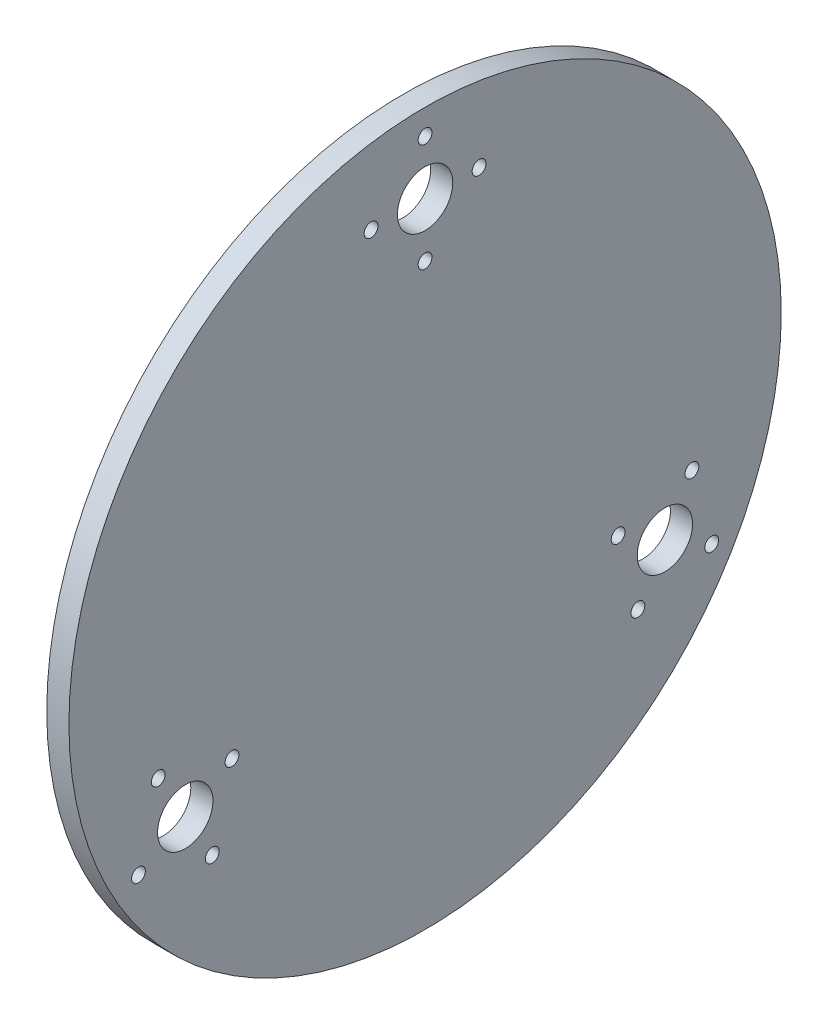
ISO-10303-21;
HEADER;
FILE_DESCRIPTION(('STEP AP214'),'2;1');
FILE_NAME('part.step','',(''),(''),'','','');
FILE_SCHEMA(('AUTOMOTIVE_DESIGN { 1 0 10303 214 1 1 1 1 }'));
ENDSEC;
DATA;
#1=APPLICATION_CONTEXT('core data for automotive mechanical design processes');
#2=APPLICATION_PROTOCOL_DEFINITION('international standard','automotive_design',2000,#1);
#3=PRODUCT_CONTEXT('',#1,'mechanical');
#4=PRODUCT('Part','Part','',(#3));
#5=PRODUCT_RELATED_PRODUCT_CATEGORY('part','',(#4));
#6=PRODUCT_DEFINITION_FORMATION('','',#4);
#7=PRODUCT_DEFINITION_CONTEXT('part definition',#1,'design');
#8=PRODUCT_DEFINITION('design','',#6,#7);
#9=PRODUCT_DEFINITION_SHAPE('','',#8);
#10=(LENGTH_UNIT() NAMED_UNIT(*) SI_UNIT(.MILLI.,.METRE.));
#11=(NAMED_UNIT(*) PLANE_ANGLE_UNIT() SI_UNIT($,.RADIAN.));
#12=(NAMED_UNIT(*) SI_UNIT($,.STERADIAN.) SOLID_ANGLE_UNIT());
#13=UNCERTAINTY_MEASURE_WITH_UNIT(LENGTH_MEASURE(1.E-05),#10,'distance_accuracy_value','');
#14=(GEOMETRIC_REPRESENTATION_CONTEXT(3) GLOBAL_UNCERTAINTY_ASSIGNED_CONTEXT((#13)) GLOBAL_UNIT_ASSIGNED_CONTEXT((#10,
#11,#12)) REPRESENTATION_CONTEXT('',''));
#15=CARTESIAN_POINT('',(0.,0.,0.));
#16=DIRECTION('',(0.,0.,1.));
#17=DIRECTION('',(1.,0.,0.));
#18=AXIS2_PLACEMENT_3D('',#15,#16,#17);
#19=CARTESIAN_POINT('',(4.,0.,0.));
#20=DIRECTION('',(1.,0.,0.));
#21=DIRECTION('',(0.,0.,-1.));
#22=AXIS2_PLACEMENT_3D('',#19,#20,#21);
#23=PLANE('',#22);
#24=CARTESIAN_POINT('',(4.,-20.1250000000015,34.857522502321));
#25=DIRECTION('',(1.,0.,0.));
#26=DIRECTION('',(0.,0.,-1.));
#27=AXIS2_PLACEMENT_3D('',#24,#25,#26);
#28=CIRCLE('',#27,1.25);
#29=CARTESIAN_POINT('',(4.,-20.1250000000015,33.607522502321));
#30=VERTEX_POINT('',#29);
#31=EDGE_CURVE('E122',#30,#30,#28,.T.);
#32=ORIENTED_EDGE('',*,*,#31,.F.);
#33=EDGE_LOOP('',(#32));
#34=FACE_BOUND('',#33,.T.);
#35=CARTESIAN_POINT('',(4.,-29.8750000000015,51.7450178761176));
#36=DIRECTION('',(1.,0.,0.));
#37=DIRECTION('',(0.,0.,-1.));
#38=AXIS2_PLACEMENT_3D('',#35,#36,#37);
#39=CIRCLE('',#38,1.25);
#40=CARTESIAN_POINT('',(4.,-29.8750000000015,50.4950178761176));
#41=VERTEX_POINT('',#40);
#42=EDGE_CURVE('E110',#41,#41,#39,.T.);
#43=ORIENTED_EDGE('',*,*,#42,.F.);
#44=EDGE_LOOP('',(#43));
#45=FACE_BOUND('',#44,.T.);
#46=CARTESIAN_POINT('',(4.,-16.5562523131002,-48.1762701892246));
#47=DIRECTION('',(1.,0.,0.));
#48=DIRECTION('',(0.,0.,-1.));
#49=AXIS2_PLACEMENT_3D('',#46,#47,#48);
#50=CIRCLE('',#49,1.25);
#51=CARTESIAN_POINT('',(4.,-16.5562523131002,-49.4262701892246));
#52=VERTEX_POINT('',#51);
#53=EDGE_CURVE('E98',#52,#52,#50,.T.);
#54=ORIENTED_EDGE('',*,*,#53,.F.);
#55=EDGE_LOOP('',(#54));
#56=FACE_BOUND('',#55,.T.);
#57=CARTESIAN_POINT('',(4.,50.,9.75));
#58=DIRECTION('',(1.,0.,0.));
#59=DIRECTION('',(0.,0.,-1.));
#60=AXIS2_PLACEMENT_3D('',#57,#58,#59);
#61=CIRCLE('',#60,1.25);
#62=CARTESIAN_POINT('',(4.,50.,8.5));
#63=VERTEX_POINT('',#62);
#64=EDGE_CURVE('E86',#63,#63,#61,.T.);
#65=ORIENTED_EDGE('',*,*,#64,.F.);
#66=EDGE_LOOP('',(#65));
#67=FACE_BOUND('',#66,.T.);
#68=CARTESIAN_POINT('',(4.,50.,-9.75));
#69=DIRECTION('',(1.,0.,0.));
#70=DIRECTION('',(0.,0.,-1.));
#71=AXIS2_PLACEMENT_3D('',#68,#69,#70);
#72=CIRCLE('',#71,1.25);
#73=CARTESIAN_POINT('',(4.,50.,-11.));
#74=VERTEX_POINT('',#73);
#75=EDGE_CURVE('E74',#74,#74,#72,.T.);
#76=ORIENTED_EDGE('',*,*,#75,.F.);
#77=EDGE_LOOP('',(#76));
#78=FACE_BOUND('',#77,.T.);
#79=CARTESIAN_POINT('',(4.,-29.8749999999985,-51.7450178761229));
#80=DIRECTION('',(1.,0.,0.));
#81=DIRECTION('',(0.,0.,-1.));
#82=AXIS2_PLACEMENT_3D('',#79,#80,#81);
#83=CIRCLE('',#82,1.25);
#84=CARTESIAN_POINT('',(4.,-29.8749999999985,-52.9950178761229));
#85=VERTEX_POINT('',#84);
#86=EDGE_CURVE('E62',#85,#85,#83,.T.);
#87=ORIENTED_EDGE('',*,*,#86,.F.);
#88=EDGE_LOOP('',(#87));
#89=FACE_BOUND('',#88,.T.);
#90=CARTESIAN_POINT('',(4.,-24.9999999999985,-43.3012701892246));
#91=DIRECTION('',(1.,0.,0.));
#92=DIRECTION('',(0.,0.,-1.));
#93=AXIS2_PLACEMENT_3D('',#90,#91,#92);
#94=CIRCLE('',#93,5.00000000000231);
#95=CARTESIAN_POINT('',(4.,-24.9999999999985,-48.3012701892269));
#96=VERTEX_POINT('',#95);
#97=EDGE_CURVE('E50',#96,#96,#94,.T.);
#98=ORIENTED_EDGE('',*,*,#97,.F.);
#99=EDGE_LOOP('',(#98));
#100=FACE_BOUND('',#99,.T.);
#101=CARTESIAN_POINT('',(4.,0.,0.));
#102=DIRECTION('',(1.,0.,0.));
#103=DIRECTION('',(0.,0.,-1.));
#104=AXIS2_PLACEMENT_3D('',#101,#102,#103);
#105=CIRCLE('',#104,64.3085896706992);
#106=CARTESIAN_POINT('',(4.,0.,-64.3085896706992));
#107=VERTEX_POINT('',#106);
#108=EDGE_CURVE('E10',#107,#107,#105,.T.);
#109=ORIENTED_EDGE('',*,*,#108,.T.);
#110=EDGE_LOOP('',(#109));
#111=FACE_BOUND('',#110,.T.);
#112=CARTESIAN_POINT('',(4.,50.,0.));
#113=DIRECTION('',(1.,0.,0.));
#114=DIRECTION('',(0.,0.,-1.));
#115=AXIS2_PLACEMENT_3D('',#112,#113,#114);
#116=CIRCLE('',#115,5.);
#117=CARTESIAN_POINT('',(4.,50.,-5.));
#118=VERTEX_POINT('',#117);
#119=EDGE_CURVE('E45',#118,#118,#116,.T.);
#120=ORIENTED_EDGE('',*,*,#119,.F.);
#121=EDGE_LOOP('',(#120));
#122=FACE_BOUND('',#121,.T.);
#123=CARTESIAN_POINT('',(4.,59.75,0.));
#124=DIRECTION('',(1.,0.,0.));
#125=DIRECTION('',(0.,0.,-1.));
#126=AXIS2_PLACEMENT_3D('',#123,#124,#125);
#127=CIRCLE('',#126,1.25);
#128=CARTESIAN_POINT('',(4.,59.75,-1.25));
#129=VERTEX_POINT('',#128);
#130=EDGE_CURVE('E56',#129,#129,#127,.T.);
#131=ORIENTED_EDGE('',*,*,#130,.F.);
#132=EDGE_LOOP('',(#131));
#133=FACE_BOUND('',#132,.T.);
#134=CARTESIAN_POINT('',(4.,-33.4437476868967,-38.4262701892246));
#135=DIRECTION('',(1.,0.,0.));
#136=DIRECTION('',(0.,0.,-1.));
#137=AXIS2_PLACEMENT_3D('',#134,#135,#136);
#138=CIRCLE('',#137,1.25);
#139=CARTESIAN_POINT('',(4.,-33.4437476868967,-39.6762701892246));
#140=VERTEX_POINT('',#139);
#141=EDGE_CURVE('E68',#140,#140,#138,.T.);
#142=ORIENTED_EDGE('',*,*,#141,.F.);
#143=EDGE_LOOP('',(#142));
#144=FACE_BOUND('',#143,.T.);
#145=CARTESIAN_POINT('',(4.,40.25,0.));
#146=DIRECTION('',(1.,0.,0.));
#147=DIRECTION('',(0.,0.,-1.));
#148=AXIS2_PLACEMENT_3D('',#145,#146,#147);
#149=CIRCLE('',#148,1.25);
#150=CARTESIAN_POINT('',(4.,40.25,-1.25));
#151=VERTEX_POINT('',#150);
#152=EDGE_CURVE('E80',#151,#151,#149,.T.);
#153=ORIENTED_EDGE('',*,*,#152,.F.);
#154=EDGE_LOOP('',(#153));
#155=FACE_BOUND('',#154,.T.);
#156=CARTESIAN_POINT('',(4.,-20.1249999999984,-34.8575225023263));
#157=DIRECTION('',(1.,0.,0.));
#158=DIRECTION('',(0.,0.,-1.));
#159=AXIS2_PLACEMENT_3D('',#156,#157,#158);
#160=CIRCLE('',#159,1.25);
#161=CARTESIAN_POINT('',(4.,-20.1249999999984,-36.1075225023263));
#162=VERTEX_POINT('',#161);
#163=EDGE_CURVE('E92',#162,#162,#160,.T.);
#164=ORIENTED_EDGE('',*,*,#163,.F.);
#165=EDGE_LOOP('',(#164));
#166=FACE_BOUND('',#165,.T.);
#167=CARTESIAN_POINT('',(4.,-25.0000000000015,43.3012701892193));
#168=DIRECTION('',(1.,0.,0.));
#169=DIRECTION('',(0.,0.,-1.));
#170=AXIS2_PLACEMENT_3D('',#167,#168,#169);
#171=CIRCLE('',#170,5.00000000000343);
#172=CARTESIAN_POINT('',(4.,-25.0000000000015,38.3012701892159));
#173=VERTEX_POINT('',#172);
#174=EDGE_CURVE('E104',#173,#173,#171,.T.);
#175=ORIENTED_EDGE('',*,*,#174,.F.);
#176=EDGE_LOOP('',(#175));
#177=FACE_BOUND('',#176,.T.);
#178=CARTESIAN_POINT('',(4.,-16.5562523131033,48.1762701892193));
#179=DIRECTION('',(1.,0.,0.));
#180=DIRECTION('',(0.,0.,-1.));
#181=AXIS2_PLACEMENT_3D('',#178,#179,#180);
#182=CIRCLE('',#181,1.25);
#183=CARTESIAN_POINT('',(4.,-16.5562523131033,46.9262701892193));
#184=VERTEX_POINT('',#183);
#185=EDGE_CURVE('E116',#184,#184,#182,.T.);
#186=ORIENTED_EDGE('',*,*,#185,.F.);
#187=EDGE_LOOP('',(#186));
#188=FACE_BOUND('',#187,.T.);
#189=CARTESIAN_POINT('',(4.,-33.4437476868998,38.4262701892193));
#190=DIRECTION('',(1.,0.,0.));
#191=DIRECTION('',(0.,0.,-1.));
#192=AXIS2_PLACEMENT_3D('',#189,#190,#191);
#193=CIRCLE('',#192,1.25);
#194=CARTESIAN_POINT('',(4.,-33.4437476868998,37.1762701892193));
#195=VERTEX_POINT('',#194);
#196=EDGE_CURVE('E128',#195,#195,#193,.T.);
#197=ORIENTED_EDGE('',*,*,#196,.F.);
#198=EDGE_LOOP('',(#197));
#199=FACE_BOUND('',#198,.T.);
#200=ADVANCED_FACE('F34',(#34,#45,#56,#67,#78,#89,#100,#111,#122,#133,#144,#155,#166,#177,#188,
#199),#23,.T.);
#201=CARTESIAN_POINT('',(0.,0.,0.));
#202=DIRECTION('',(1.,0.,0.));
#203=DIRECTION('',(0.,0.,-1.));
#204=AXIS2_PLACEMENT_3D('',#201,#202,#203);
#205=PLANE('',#204);
#206=CARTESIAN_POINT('',(0.,0.,0.));
#207=DIRECTION('',(1.,0.,0.));
#208=DIRECTION('',(0.,0.,-1.));
#209=AXIS2_PLACEMENT_3D('',#206,#207,#208);
#210=CIRCLE('',#209,64.3085896706992);
#211=CARTESIAN_POINT('',(0.,0.,-64.3085896706992));
#212=VERTEX_POINT('',#211);
#213=EDGE_CURVE('E38',#212,#212,#210,.T.);
#214=ORIENTED_EDGE('',*,*,#213,.F.);
#215=EDGE_LOOP('',(#214));
#216=FACE_BOUND('',#215,.T.);
#217=CARTESIAN_POINT('',(0.,50.,0.));
#218=DIRECTION('',(1.,0.,0.));
#219=DIRECTION('',(0.,0.,-1.));
#220=AXIS2_PLACEMENT_3D('',#217,#218,#219);
#221=CIRCLE('',#220,5.);
#222=CARTESIAN_POINT('',(0.,50.,-5.));
#223=VERTEX_POINT('',#222);
#224=EDGE_CURVE('E47',#223,#223,#221,.T.);
#225=ORIENTED_EDGE('',*,*,#224,.T.);
#226=EDGE_LOOP('',(#225));
#227=FACE_BOUND('',#226,.T.);
#228=CARTESIAN_POINT('',(0.,-24.9999999999985,-43.3012701892246));
#229=DIRECTION('',(1.,0.,0.));
#230=DIRECTION('',(0.,0.,-1.));
#231=AXIS2_PLACEMENT_3D('',#228,#229,#230);
#232=CIRCLE('',#231,5.00000000000231);
#233=CARTESIAN_POINT('',(0.,-24.9999999999985,-48.3012701892269));
#234=VERTEX_POINT('',#233);
#235=EDGE_CURVE('E53',#234,#234,#232,.T.);
#236=ORIENTED_EDGE('',*,*,#235,.T.);
#237=EDGE_LOOP('',(#236));
#238=FACE_BOUND('',#237,.T.);
#239=CARTESIAN_POINT('',(0.,59.75,0.));
#240=DIRECTION('',(1.,0.,0.));
#241=DIRECTION('',(0.,0.,-1.));
#242=AXIS2_PLACEMENT_3D('',#239,#240,#241);
#243=CIRCLE('',#242,1.25);
#244=CARTESIAN_POINT('',(0.,59.75,-1.25));
#245=VERTEX_POINT('',#244);
#246=EDGE_CURVE('E59',#245,#245,#243,.T.);
#247=ORIENTED_EDGE('',*,*,#246,.T.);
#248=EDGE_LOOP('',(#247));
#249=FACE_BOUND('',#248,.T.);
#250=CARTESIAN_POINT('',(0.,-29.8749999999985,-51.7450178761229));
#251=DIRECTION('',(1.,0.,0.));
#252=DIRECTION('',(0.,0.,-1.));
#253=AXIS2_PLACEMENT_3D('',#250,#251,#252);
#254=CIRCLE('',#253,1.25);
#255=CARTESIAN_POINT('',(0.,-29.8749999999985,-52.9950178761229));
#256=VERTEX_POINT('',#255);
#257=EDGE_CURVE('E65',#256,#256,#254,.T.);
#258=ORIENTED_EDGE('',*,*,#257,.T.);
#259=EDGE_LOOP('',(#258));
#260=FACE_BOUND('',#259,.T.);
#261=CARTESIAN_POINT('',(0.,-33.4437476868967,-38.4262701892246));
#262=DIRECTION('',(1.,0.,0.));
#263=DIRECTION('',(0.,0.,-1.));
#264=AXIS2_PLACEMENT_3D('',#261,#262,#263);
#265=CIRCLE('',#264,1.25);
#266=CARTESIAN_POINT('',(0.,-33.4437476868967,-39.6762701892246));
#267=VERTEX_POINT('',#266);
#268=EDGE_CURVE('E71',#267,#267,#265,.T.);
#269=ORIENTED_EDGE('',*,*,#268,.T.);
#270=EDGE_LOOP('',(#269));
#271=FACE_BOUND('',#270,.T.);
#272=CARTESIAN_POINT('',(0.,50.,-9.75));
#273=DIRECTION('',(1.,0.,0.));
#274=DIRECTION('',(0.,0.,-1.));
#275=AXIS2_PLACEMENT_3D('',#272,#273,#274);
#276=CIRCLE('',#275,1.25);
#277=CARTESIAN_POINT('',(0.,50.,-11.));
#278=VERTEX_POINT('',#277);
#279=EDGE_CURVE('E77',#278,#278,#276,.T.);
#280=ORIENTED_EDGE('',*,*,#279,.T.);
#281=EDGE_LOOP('',(#280));
#282=FACE_BOUND('',#281,.T.);
#283=CARTESIAN_POINT('',(0.,40.25,0.));
#284=DIRECTION('',(1.,0.,0.));
#285=DIRECTION('',(0.,0.,-1.));
#286=AXIS2_PLACEMENT_3D('',#283,#284,#285);
#287=CIRCLE('',#286,1.25);
#288=CARTESIAN_POINT('',(0.,40.25,-1.25));
#289=VERTEX_POINT('',#288);
#290=EDGE_CURVE('E83',#289,#289,#287,.T.);
#291=ORIENTED_EDGE('',*,*,#290,.T.);
#292=EDGE_LOOP('',(#291));
#293=FACE_BOUND('',#292,.T.);
#294=CARTESIAN_POINT('',(0.,50.,9.75));
#295=DIRECTION('',(1.,0.,0.));
#296=DIRECTION('',(0.,0.,-1.));
#297=AXIS2_PLACEMENT_3D('',#294,#295,#296);
#298=CIRCLE('',#297,1.25);
#299=CARTESIAN_POINT('',(0.,50.,8.5));
#300=VERTEX_POINT('',#299);
#301=EDGE_CURVE('E89',#300,#300,#298,.T.);
#302=ORIENTED_EDGE('',*,*,#301,.T.);
#303=EDGE_LOOP('',(#302));
#304=FACE_BOUND('',#303,.T.);
#305=CARTESIAN_POINT('',(0.,-20.1249999999984,-34.8575225023263));
#306=DIRECTION('',(1.,0.,0.));
#307=DIRECTION('',(0.,0.,-1.));
#308=AXIS2_PLACEMENT_3D('',#305,#306,#307);
#309=CIRCLE('',#308,1.25);
#310=CARTESIAN_POINT('',(0.,-20.1249999999984,-36.1075225023263));
#311=VERTEX_POINT('',#310);
#312=EDGE_CURVE('E95',#311,#311,#309,.T.);
#313=ORIENTED_EDGE('',*,*,#312,.T.);
#314=EDGE_LOOP('',(#313));
#315=FACE_BOUND('',#314,.T.);
#316=CARTESIAN_POINT('',(0.,-16.5562523131002,-48.1762701892246));
#317=DIRECTION('',(1.,0.,0.));
#318=DIRECTION('',(0.,0.,-1.));
#319=AXIS2_PLACEMENT_3D('',#316,#317,#318);
#320=CIRCLE('',#319,1.25);
#321=CARTESIAN_POINT('',(0.,-16.5562523131002,-49.4262701892246));
#322=VERTEX_POINT('',#321);
#323=EDGE_CURVE('E101',#322,#322,#320,.T.);
#324=ORIENTED_EDGE('',*,*,#323,.T.);
#325=EDGE_LOOP('',(#324));
#326=FACE_BOUND('',#325,.T.);
#327=CARTESIAN_POINT('',(0.,-25.0000000000015,43.3012701892193));
#328=DIRECTION('',(1.,0.,0.));
#329=DIRECTION('',(0.,0.,-1.));
#330=AXIS2_PLACEMENT_3D('',#327,#328,#329);
#331=CIRCLE('',#330,5.00000000000343);
#332=CARTESIAN_POINT('',(0.,-25.0000000000015,38.3012701892159));
#333=VERTEX_POINT('',#332);
#334=EDGE_CURVE('E107',#333,#333,#331,.T.);
#335=ORIENTED_EDGE('',*,*,#334,.T.);
#336=EDGE_LOOP('',(#335));
#337=FACE_BOUND('',#336,.T.);
#338=CARTESIAN_POINT('',(0.,-29.8750000000015,51.7450178761176));
#339=DIRECTION('',(1.,0.,0.));
#340=DIRECTION('',(0.,0.,-1.));
#341=AXIS2_PLACEMENT_3D('',#338,#339,#340);
#342=CIRCLE('',#341,1.25);
#343=CARTESIAN_POINT('',(0.,-29.8750000000015,50.4950178761176));
#344=VERTEX_POINT('',#343);
#345=EDGE_CURVE('E113',#344,#344,#342,.T.);
#346=ORIENTED_EDGE('',*,*,#345,.T.);
#347=EDGE_LOOP('',(#346));
#348=FACE_BOUND('',#347,.T.);
#349=CARTESIAN_POINT('',(0.,-16.5562523131033,48.1762701892193));
#350=DIRECTION('',(1.,0.,0.));
#351=DIRECTION('',(0.,0.,-1.));
#352=AXIS2_PLACEMENT_3D('',#349,#350,#351);
#353=CIRCLE('',#352,1.25);
#354=CARTESIAN_POINT('',(0.,-16.5562523131033,46.9262701892193));
#355=VERTEX_POINT('',#354);
#356=EDGE_CURVE('E119',#355,#355,#353,.T.);
#357=ORIENTED_EDGE('',*,*,#356,.T.);
#358=EDGE_LOOP('',(#357));
#359=FACE_BOUND('',#358,.T.);
#360=CARTESIAN_POINT('',(0.,-20.1250000000015,34.857522502321));
#361=DIRECTION('',(1.,0.,0.));
#362=DIRECTION('',(0.,0.,-1.));
#363=AXIS2_PLACEMENT_3D('',#360,#361,#362);
#364=CIRCLE('',#363,1.25);
#365=CARTESIAN_POINT('',(0.,-20.1250000000015,33.607522502321));
#366=VERTEX_POINT('',#365);
#367=EDGE_CURVE('E125',#366,#366,#364,.T.);
#368=ORIENTED_EDGE('',*,*,#367,.T.);
#369=EDGE_LOOP('',(#368));
#370=FACE_BOUND('',#369,.T.);
#371=CARTESIAN_POINT('',(0.,-33.4437476868998,38.4262701892193));
#372=DIRECTION('',(1.,0.,0.));
#373=DIRECTION('',(0.,0.,-1.));
#374=AXIS2_PLACEMENT_3D('',#371,#372,#373);
#375=CIRCLE('',#374,1.25);
#376=CARTESIAN_POINT('',(0.,-33.4437476868998,37.1762701892193));
#377=VERTEX_POINT('',#376);
#378=EDGE_CURVE('E131',#377,#377,#375,.T.);
#379=ORIENTED_EDGE('',*,*,#378,.T.);
#380=EDGE_LOOP('',(#379));
#381=FACE_BOUND('',#380,.T.);
#382=ADVANCED_FACE('F141',(#216,#227,#238,#249,#260,#271,#282,#293,#304,#315,#326,#337,#348,
#359,#370,#381),#205,.F.);
#383=CARTESIAN_POINT('',(4.,0.,0.));
#384=DIRECTION('',(-1.,0.,0.));
#385=DIRECTION('',(0.,0.,1.));
#386=AXIS2_PLACEMENT_3D('',#383,#384,#385);
#387=CYLINDRICAL_SURFACE('',#386,64.3085896706992);
#388=ORIENTED_EDGE('',*,*,#108,.F.);
#389=EDGE_LOOP('',(#388));
#390=FACE_BOUND('',#389,.T.);
#391=ORIENTED_EDGE('',*,*,#213,.T.);
#392=EDGE_LOOP('',(#391));
#393=FACE_BOUND('',#392,.T.);
#394=ADVANCED_FACE('F36',(#390,#393),#387,.T.);
#395=CARTESIAN_POINT('',(4.,50.,0.));
#396=DIRECTION('',(-1.,0.,0.));
#397=DIRECTION('',(0.,0.,1.));
#398=AXIS2_PLACEMENT_3D('',#395,#396,#397);
#399=CYLINDRICAL_SURFACE('',#398,5.);
#400=ORIENTED_EDGE('',*,*,#119,.T.);
#401=EDGE_LOOP('',(#400));
#402=FACE_BOUND('',#401,.T.);
#403=ORIENTED_EDGE('',*,*,#224,.F.);
#404=EDGE_LOOP('',(#403));
#405=FACE_BOUND('',#404,.T.);
#406=ADVANCED_FACE('F151',(#402,#405),#399,.F.);
#407=CARTESIAN_POINT('',(4.,-24.9999999999985,-43.3012701892246));
#408=DIRECTION('',(-1.,0.,0.));
#409=DIRECTION('',(0.,0.,1.));
#410=AXIS2_PLACEMENT_3D('',#407,#408,#409);
#411=CYLINDRICAL_SURFACE('',#410,5.00000000000231);
#412=ORIENTED_EDGE('',*,*,#97,.T.);
#413=EDGE_LOOP('',(#412));
#414=FACE_BOUND('',#413,.T.);
#415=ORIENTED_EDGE('',*,*,#235,.F.);
#416=EDGE_LOOP('',(#415));
#417=FACE_BOUND('',#416,.T.);
#418=ADVANCED_FACE('F154',(#414,#417),#411,.F.);
#419=CARTESIAN_POINT('',(4.,59.75,0.));
#420=DIRECTION('',(-1.,0.,0.));
#421=DIRECTION('',(0.,0.,1.));
#422=AXIS2_PLACEMENT_3D('',#419,#420,#421);
#423=CYLINDRICAL_SURFACE('',#422,1.25);
#424=ORIENTED_EDGE('',*,*,#130,.T.);
#425=EDGE_LOOP('',(#424));
#426=FACE_BOUND('',#425,.T.);
#427=ORIENTED_EDGE('',*,*,#246,.F.);
#428=EDGE_LOOP('',(#427));
#429=FACE_BOUND('',#428,.T.);
#430=ADVANCED_FACE('F158',(#426,#429),#423,.F.);
#431=CARTESIAN_POINT('',(4.,-29.8749999999985,-51.7450178761229));
#432=DIRECTION('',(-1.,0.,0.));
#433=DIRECTION('',(0.,0.,1.));
#434=AXIS2_PLACEMENT_3D('',#431,#432,#433);
#435=CYLINDRICAL_SURFACE('',#434,1.25);
#436=ORIENTED_EDGE('',*,*,#86,.T.);
#437=EDGE_LOOP('',(#436));
#438=FACE_BOUND('',#437,.T.);
#439=ORIENTED_EDGE('',*,*,#257,.F.);
#440=EDGE_LOOP('',(#439));
#441=FACE_BOUND('',#440,.T.);
#442=ADVANCED_FACE('F162',(#438,#441),#435,.F.);
#443=CARTESIAN_POINT('',(4.,-33.4437476868967,-38.4262701892246));
#444=DIRECTION('',(-1.,0.,0.));
#445=DIRECTION('',(0.,0.,1.));
#446=AXIS2_PLACEMENT_3D('',#443,#444,#445);
#447=CYLINDRICAL_SURFACE('',#446,1.25);
#448=ORIENTED_EDGE('',*,*,#141,.T.);
#449=EDGE_LOOP('',(#448));
#450=FACE_BOUND('',#449,.T.);
#451=ORIENTED_EDGE('',*,*,#268,.F.);
#452=EDGE_LOOP('',(#451));
#453=FACE_BOUND('',#452,.T.);
#454=ADVANCED_FACE('F166',(#450,#453),#447,.F.);
#455=CARTESIAN_POINT('',(4.,50.,-9.75));
#456=DIRECTION('',(-1.,0.,0.));
#457=DIRECTION('',(0.,0.,1.));
#458=AXIS2_PLACEMENT_3D('',#455,#456,#457);
#459=CYLINDRICAL_SURFACE('',#458,1.25);
#460=ORIENTED_EDGE('',*,*,#75,.T.);
#461=EDGE_LOOP('',(#460));
#462=FACE_BOUND('',#461,.T.);
#463=ORIENTED_EDGE('',*,*,#279,.F.);
#464=EDGE_LOOP('',(#463));
#465=FACE_BOUND('',#464,.T.);
#466=ADVANCED_FACE('F170',(#462,#465),#459,.F.);
#467=CARTESIAN_POINT('',(4.,40.25,0.));
#468=DIRECTION('',(-1.,0.,0.));
#469=DIRECTION('',(0.,0.,1.));
#470=AXIS2_PLACEMENT_3D('',#467,#468,#469);
#471=CYLINDRICAL_SURFACE('',#470,1.25);
#472=ORIENTED_EDGE('',*,*,#152,.T.);
#473=EDGE_LOOP('',(#472));
#474=FACE_BOUND('',#473,.T.);
#475=ORIENTED_EDGE('',*,*,#290,.F.);
#476=EDGE_LOOP('',(#475));
#477=FACE_BOUND('',#476,.T.);
#478=ADVANCED_FACE('F174',(#474,#477),#471,.F.);
#479=CARTESIAN_POINT('',(4.,50.,9.75));
#480=DIRECTION('',(-1.,0.,0.));
#481=DIRECTION('',(0.,0.,1.));
#482=AXIS2_PLACEMENT_3D('',#479,#480,#481);
#483=CYLINDRICAL_SURFACE('',#482,1.25);
#484=ORIENTED_EDGE('',*,*,#64,.T.);
#485=EDGE_LOOP('',(#484));
#486=FACE_BOUND('',#485,.T.);
#487=ORIENTED_EDGE('',*,*,#301,.F.);
#488=EDGE_LOOP('',(#487));
#489=FACE_BOUND('',#488,.T.);
#490=ADVANCED_FACE('F178',(#486,#489),#483,.F.);
#491=CARTESIAN_POINT('',(4.,-20.1249999999984,-34.8575225023263));
#492=DIRECTION('',(-1.,0.,0.));
#493=DIRECTION('',(0.,0.,1.));
#494=AXIS2_PLACEMENT_3D('',#491,#492,#493);
#495=CYLINDRICAL_SURFACE('',#494,1.25);
#496=ORIENTED_EDGE('',*,*,#163,.T.);
#497=EDGE_LOOP('',(#496));
#498=FACE_BOUND('',#497,.T.);
#499=ORIENTED_EDGE('',*,*,#312,.F.);
#500=EDGE_LOOP('',(#499));
#501=FACE_BOUND('',#500,.T.);
#502=ADVANCED_FACE('F182',(#498,#501),#495,.F.);
#503=CARTESIAN_POINT('',(4.,-16.5562523131002,-48.1762701892246));
#504=DIRECTION('',(-1.,0.,0.));
#505=DIRECTION('',(0.,0.,1.));
#506=AXIS2_PLACEMENT_3D('',#503,#504,#505);
#507=CYLINDRICAL_SURFACE('',#506,1.25);
#508=ORIENTED_EDGE('',*,*,#53,.T.);
#509=EDGE_LOOP('',(#508));
#510=FACE_BOUND('',#509,.T.);
#511=ORIENTED_EDGE('',*,*,#323,.F.);
#512=EDGE_LOOP('',(#511));
#513=FACE_BOUND('',#512,.T.);
#514=ADVANCED_FACE('F186',(#510,#513),#507,.F.);
#515=CARTESIAN_POINT('',(4.,-25.0000000000015,43.3012701892193));
#516=DIRECTION('',(-1.,0.,0.));
#517=DIRECTION('',(0.,0.,1.));
#518=AXIS2_PLACEMENT_3D('',#515,#516,#517);
#519=CYLINDRICAL_SURFACE('',#518,5.00000000000343);
#520=ORIENTED_EDGE('',*,*,#174,.T.);
#521=EDGE_LOOP('',(#520));
#522=FACE_BOUND('',#521,.T.);
#523=ORIENTED_EDGE('',*,*,#334,.F.);
#524=EDGE_LOOP('',(#523));
#525=FACE_BOUND('',#524,.T.);
#526=ADVANCED_FACE('F190',(#522,#525),#519,.F.);
#527=CARTESIAN_POINT('',(4.,-29.8750000000015,51.7450178761176));
#528=DIRECTION('',(-1.,0.,0.));
#529=DIRECTION('',(0.,0.,1.));
#530=AXIS2_PLACEMENT_3D('',#527,#528,#529);
#531=CYLINDRICAL_SURFACE('',#530,1.25);
#532=ORIENTED_EDGE('',*,*,#42,.T.);
#533=EDGE_LOOP('',(#532));
#534=FACE_BOUND('',#533,.T.);
#535=ORIENTED_EDGE('',*,*,#345,.F.);
#536=EDGE_LOOP('',(#535));
#537=FACE_BOUND('',#536,.T.);
#538=ADVANCED_FACE('F194',(#534,#537),#531,.F.);
#539=CARTESIAN_POINT('',(4.,-16.5562523131033,48.1762701892193));
#540=DIRECTION('',(-1.,0.,0.));
#541=DIRECTION('',(0.,0.,1.));
#542=AXIS2_PLACEMENT_3D('',#539,#540,#541);
#543=CYLINDRICAL_SURFACE('',#542,1.25);
#544=ORIENTED_EDGE('',*,*,#185,.T.);
#545=EDGE_LOOP('',(#544));
#546=FACE_BOUND('',#545,.T.);
#547=ORIENTED_EDGE('',*,*,#356,.F.);
#548=EDGE_LOOP('',(#547));
#549=FACE_BOUND('',#548,.T.);
#550=ADVANCED_FACE('F198',(#546,#549),#543,.F.);
#551=CARTESIAN_POINT('',(4.,-20.1250000000015,34.857522502321));
#552=DIRECTION('',(-1.,0.,0.));
#553=DIRECTION('',(0.,0.,1.));
#554=AXIS2_PLACEMENT_3D('',#551,#552,#553);
#555=CYLINDRICAL_SURFACE('',#554,1.25);
#556=ORIENTED_EDGE('',*,*,#31,.T.);
#557=EDGE_LOOP('',(#556));
#558=FACE_BOUND('',#557,.T.);
#559=ORIENTED_EDGE('',*,*,#367,.F.);
#560=EDGE_LOOP('',(#559));
#561=FACE_BOUND('',#560,.T.);
#562=ADVANCED_FACE('F202',(#558,#561),#555,.F.);
#563=CARTESIAN_POINT('',(4.,-33.4437476868998,38.4262701892193));
#564=DIRECTION('',(-1.,0.,0.));
#565=DIRECTION('',(0.,0.,1.));
#566=AXIS2_PLACEMENT_3D('',#563,#564,#565);
#567=CYLINDRICAL_SURFACE('',#566,1.25);
#568=ORIENTED_EDGE('',*,*,#196,.T.);
#569=EDGE_LOOP('',(#568));
#570=FACE_BOUND('',#569,.T.);
#571=ORIENTED_EDGE('',*,*,#378,.F.);
#572=EDGE_LOOP('',(#571));
#573=FACE_BOUND('',#572,.T.);
#574=ADVANCED_FACE('F137',(#570,#573),#567,.F.);
#575=CLOSED_SHELL('',(#200,#382,#394,#406,#418,#430,#442,#454,#466,#478,#490,#502,#514,#526,
#538,#550,#562,#574));
#576=MANIFOLD_SOLID_BREP('B2',#575);
#577=ADVANCED_BREP_SHAPE_REPRESENTATION('',(#18,#576),#14);
#578=SHAPE_DEFINITION_REPRESENTATION(#9,#577);
ENDSEC;
END-ISO-10303-21;
